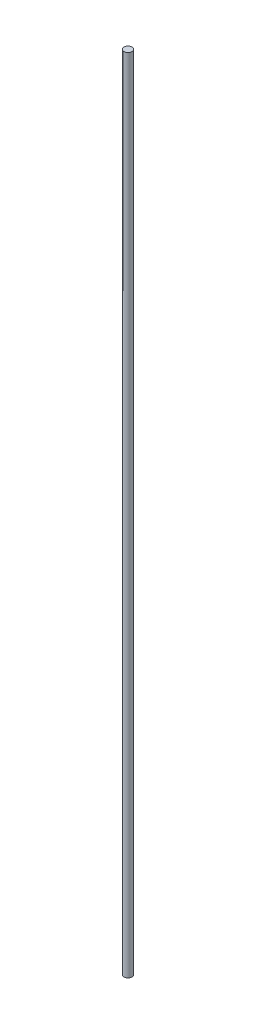
ISO-10303-21;
HEADER;
FILE_DESCRIPTION(('STEP AP214'),'2;1');
FILE_NAME('part.step','',(''),(''),'','','');
FILE_SCHEMA(('AUTOMOTIVE_DESIGN { 1 0 10303 214 1 1 1 1 }'));
ENDSEC;
DATA;
#1=APPLICATION_CONTEXT('core data for automotive mechanical design processes');
#2=APPLICATION_PROTOCOL_DEFINITION('international standard','automotive_design',2000,#1);
#3=PRODUCT_CONTEXT('',#1,'mechanical');
#4=PRODUCT('Part','Part','',(#3));
#5=PRODUCT_RELATED_PRODUCT_CATEGORY('part','',(#4));
#6=PRODUCT_DEFINITION_FORMATION('','',#4);
#7=PRODUCT_DEFINITION_CONTEXT('part definition',#1,'design');
#8=PRODUCT_DEFINITION('design','',#6,#7);
#9=PRODUCT_DEFINITION_SHAPE('','',#8);
#10=(LENGTH_UNIT() NAMED_UNIT(*) SI_UNIT(.MILLI.,.METRE.));
#11=(NAMED_UNIT(*) PLANE_ANGLE_UNIT() SI_UNIT($,.RADIAN.));
#12=(NAMED_UNIT(*) SI_UNIT($,.STERADIAN.) SOLID_ANGLE_UNIT());
#13=UNCERTAINTY_MEASURE_WITH_UNIT(LENGTH_MEASURE(1.E-05),#10,'distance_accuracy_value','');
#14=(GEOMETRIC_REPRESENTATION_CONTEXT(3) GLOBAL_UNCERTAINTY_ASSIGNED_CONTEXT((#13)) GLOBAL_UNIT_ASSIGNED_CONTEXT((#10,
#11,#12)) REPRESENTATION_CONTEXT('',''));
#15=CARTESIAN_POINT('',(0.,0.,0.));
#16=DIRECTION('',(0.,0.,1.));
#17=DIRECTION('',(1.,0.,0.));
#18=AXIS2_PLACEMENT_3D('',#15,#16,#17);
#19=CARTESIAN_POINT('',(0.,500.,0.));
#20=DIRECTION('',(0.,-1.,0.));
#21=DIRECTION('',(0.,0.,-1.));
#22=AXIS2_PLACEMENT_3D('',#19,#20,#21);
#23=CYLINDRICAL_SURFACE('',#22,2.5);
#24=CARTESIAN_POINT('',(0.,500.,0.));
#25=DIRECTION('',(0.,1.,0.));
#26=DIRECTION('',(0.,0.,1.));
#27=AXIS2_PLACEMENT_3D('',#24,#25,#26);
#28=CIRCLE('',#27,2.5);
#29=CARTESIAN_POINT('',(0.,500.,2.5));
#30=VERTEX_POINT('',#29);
#31=EDGE_CURVE('E10',#30,#30,#28,.T.);
#32=ORIENTED_EDGE('',*,*,#31,.F.);
#33=EDGE_LOOP('',(#32));
#34=FACE_BOUND('',#33,.T.);
#35=CARTESIAN_POINT('',(0.,0.,0.));
#36=DIRECTION('',(0.,1.,0.));
#37=DIRECTION('',(0.,0.,1.));
#38=AXIS2_PLACEMENT_3D('',#35,#36,#37);
#39=CIRCLE('',#38,2.5);
#40=CARTESIAN_POINT('',(0.,0.,2.5));
#41=VERTEX_POINT('',#40);
#42=EDGE_CURVE('E37',#41,#41,#39,.T.);
#43=ORIENTED_EDGE('',*,*,#42,.T.);
#44=EDGE_LOOP('',(#43));
#45=FACE_BOUND('',#44,.T.);
#46=ADVANCED_FACE('F34',(#34,#45),#23,.T.);
#47=CARTESIAN_POINT('',(0.,500.,0.));
#48=DIRECTION('',(0.,1.,0.));
#49=DIRECTION('',(0.,0.,1.));
#50=AXIS2_PLACEMENT_3D('',#47,#48,#49);
#51=PLANE('',#50);
#52=ORIENTED_EDGE('',*,*,#31,.T.);
#53=EDGE_LOOP('',(#52));
#54=FACE_BOUND('',#53,.T.);
#55=ADVANCED_FACE('F49',(#54),#51,.T.);
#56=CARTESIAN_POINT('',(0.,0.,0.));
#57=DIRECTION('',(0.,1.,0.));
#58=DIRECTION('',(0.,0.,1.));
#59=AXIS2_PLACEMENT_3D('',#56,#57,#58);
#60=PLANE('',#59);
#61=ORIENTED_EDGE('',*,*,#42,.F.);
#62=EDGE_LOOP('',(#61));
#63=FACE_BOUND('',#62,.T.);
#64=ADVANCED_FACE('F47',(#63),#60,.F.);
#65=CLOSED_SHELL('',(#46,#55,#64));
#66=MANIFOLD_SOLID_BREP('B2',#65);
#67=ADVANCED_BREP_SHAPE_REPRESENTATION('',(#18,#66),#14);
#68=SHAPE_DEFINITION_REPRESENTATION(#9,#67);
ENDSEC;
END-ISO-10303-21;
